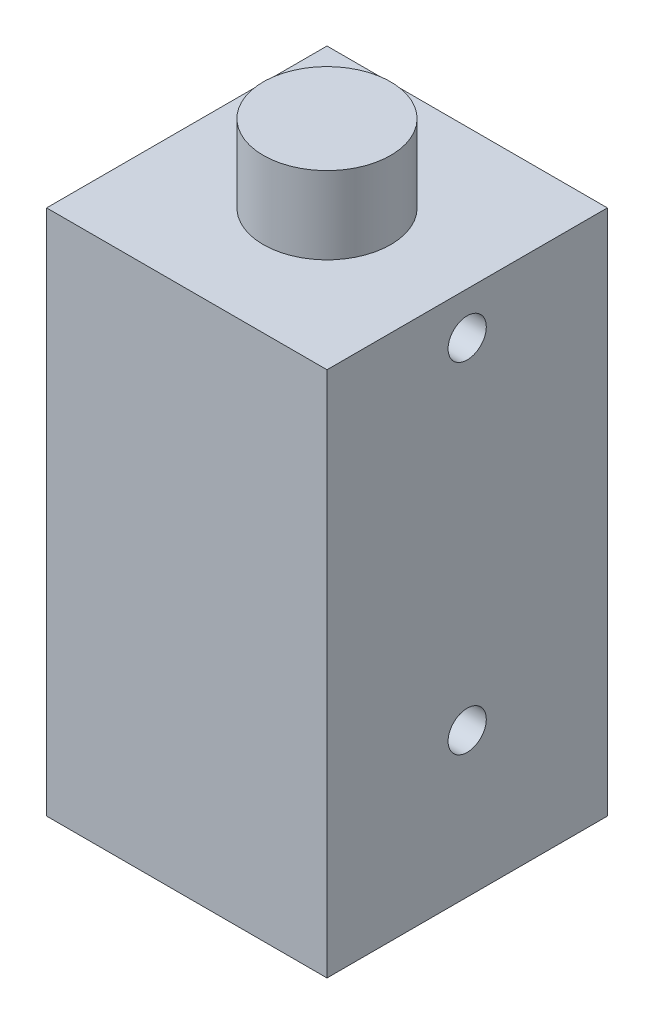
ISO-10303-21;
HEADER;
FILE_DESCRIPTION(('STEP AP214'),'2;1');
FILE_NAME('part.step','',(''),(''),'','','');
FILE_SCHEMA(('AUTOMOTIVE_DESIGN { 1 0 10303 214 1 1 1 1 }'));
ENDSEC;
DATA;
#1=APPLICATION_CONTEXT('core data for automotive mechanical design processes');
#2=APPLICATION_PROTOCOL_DEFINITION('international standard','automotive_design',2000,#1);
#3=PRODUCT_CONTEXT('',#1,'mechanical');
#4=PRODUCT('Part','Part','',(#3));
#5=PRODUCT_RELATED_PRODUCT_CATEGORY('part','',(#4));
#6=PRODUCT_DEFINITION_FORMATION('','',#4);
#7=PRODUCT_DEFINITION_CONTEXT('part definition',#1,'design');
#8=PRODUCT_DEFINITION('design','',#6,#7);
#9=PRODUCT_DEFINITION_SHAPE('','',#8);
#10=(LENGTH_UNIT() NAMED_UNIT(*) SI_UNIT(.MILLI.,.METRE.));
#11=(NAMED_UNIT(*) PLANE_ANGLE_UNIT() SI_UNIT($,.RADIAN.));
#12=(NAMED_UNIT(*) SI_UNIT($,.STERADIAN.) SOLID_ANGLE_UNIT());
#13=UNCERTAINTY_MEASURE_WITH_UNIT(LENGTH_MEASURE(1.E-05),#10,'distance_accuracy_value','');
#14=(GEOMETRIC_REPRESENTATION_CONTEXT(3) GLOBAL_UNCERTAINTY_ASSIGNED_CONTEXT((#13)) GLOBAL_UNIT_ASSIGNED_CONTEXT((#10,
#11,#12)) REPRESENTATION_CONTEXT('',''));
#15=CARTESIAN_POINT('',(0.,0.,0.));
#16=DIRECTION('',(0.,0.,1.));
#17=DIRECTION('',(1.,0.,0.));
#18=AXIS2_PLACEMENT_3D('',#15,#16,#17);
#19=CARTESIAN_POINT('',(16.5,62.,16.5));
#20=DIRECTION('',(-1.,0.,0.));
#21=DIRECTION('',(0.,0.,1.));
#22=AXIS2_PLACEMENT_3D('',#19,#20,#21);
#23=PLANE('',#22);
#24=CARTESIAN_POINT('',(16.5,57.,0.));
#25=DIRECTION('',(1.,0.,0.));
#26=DIRECTION('',(0.,0.,-1.));
#27=AXIS2_PLACEMENT_3D('',#24,#25,#26);
#28=CIRCLE('',#27,2.25);
#29=CARTESIAN_POINT('',(16.5,57.,-2.25));
#30=VERTEX_POINT('',#29);
#31=EDGE_CURVE('E122',#30,#30,#28,.T.);
#32=ORIENTED_EDGE('',*,*,#31,.F.);
#33=EDGE_LOOP('',(#32));
#34=FACE_BOUND('',#33,.T.);
#35=CARTESIAN_POINT('',(16.5,17.,0.));
#36=DIRECTION('',(1.,0.,0.));
#37=DIRECTION('',(0.,0.,-1.));
#38=AXIS2_PLACEMENT_3D('',#35,#36,#37);
#39=CIRCLE('',#38,2.25);
#40=CARTESIAN_POINT('',(16.5,17.,-2.25000000000001));
#41=VERTEX_POINT('',#40);
#42=EDGE_CURVE('E116',#41,#41,#39,.T.);
#43=ORIENTED_EDGE('',*,*,#42,.F.);
#44=EDGE_LOOP('',(#43));
#45=FACE_BOUND('',#44,.T.);
#46=DIRECTION('',(0.,0.,-1.));
#47=VECTOR('',#46,1.);
#48=CARTESIAN_POINT('',(16.5,0.,16.5));
#49=LINE('',#48,#47);
#50=CARTESIAN_POINT('',(16.5,0.,16.5));
#51=VERTEX_POINT('',#50);
#52=CARTESIAN_POINT('',(16.5,0.,-16.5));
#53=VERTEX_POINT('',#52);
#54=EDGE_CURVE('E99',#51,#53,#49,.T.);
#55=ORIENTED_EDGE('',*,*,#54,.T.);
#56=DIRECTION('',(0.,-1.,0.));
#57=VECTOR('',#56,1.);
#58=CARTESIAN_POINT('',(16.5,62.,-16.5));
#59=LINE('',#58,#57);
#60=CARTESIAN_POINT('',(16.5,62.,-16.5));
#61=VERTEX_POINT('',#60);
#62=EDGE_CURVE('E36',#61,#53,#59,.T.);
#63=ORIENTED_EDGE('',*,*,#62,.F.);
#64=DIRECTION('',(0.,0.,-1.));
#65=VECTOR('',#64,1.);
#66=CARTESIAN_POINT('',(16.5,62.,16.5));
#67=LINE('',#66,#65);
#68=CARTESIAN_POINT('',(16.5,62.,16.5));
#69=VERTEX_POINT('',#68);
#70=EDGE_CURVE('E86',#69,#61,#67,.T.);
#71=ORIENTED_EDGE('',*,*,#70,.F.);
#72=DIRECTION('',(0.,-1.,0.));
#73=VECTOR('',#72,1.);
#74=CARTESIAN_POINT('',(16.5,62.,16.5));
#75=LINE('',#74,#73);
#76=EDGE_CURVE('E95',#69,#51,#75,.T.);
#77=ORIENTED_EDGE('',*,*,#76,.T.);
#78=EDGE_LOOP('',(#55,#63,#71,#77));
#79=FACE_BOUND('',#78,.T.);
#80=ADVANCED_FACE('F33',(#34,#45,#79),#23,.F.);
#81=CARTESIAN_POINT('',(-16.5,62.,-16.5));
#82=DIRECTION('',(0.,0.,1.));
#83=DIRECTION('',(1.,0.,0.));
#84=AXIS2_PLACEMENT_3D('',#81,#82,#83);
#85=PLANE('',#84);
#86=DIRECTION('',(-1.,0.,0.));
#87=VECTOR('',#86,1.);
#88=CARTESIAN_POINT('',(-16.5,0.,-16.5));
#89=LINE('',#88,#87);
#90=CARTESIAN_POINT('',(-16.5,0.,-16.5));
#91=VERTEX_POINT('',#90);
#92=EDGE_CURVE('E91',#53,#91,#89,.T.);
#93=ORIENTED_EDGE('',*,*,#92,.T.);
#94=DIRECTION('',(0.,-1.,0.));
#95=VECTOR('',#94,1.);
#96=CARTESIAN_POINT('',(-16.5,62.,-16.5));
#97=LINE('',#96,#95);
#98=CARTESIAN_POINT('',(-16.5,62.,-16.5));
#99=VERTEX_POINT('',#98);
#100=EDGE_CURVE('E89',#99,#91,#97,.T.);
#101=ORIENTED_EDGE('',*,*,#100,.F.);
#102=DIRECTION('',(-1.,0.,0.));
#103=VECTOR('',#102,1.);
#104=CARTESIAN_POINT('',(-16.5,62.,-16.5));
#105=LINE('',#104,#103);
#106=EDGE_CURVE('E81',#61,#99,#105,.T.);
#107=ORIENTED_EDGE('',*,*,#106,.F.);
#108=ORIENTED_EDGE('',*,*,#62,.T.);
#109=EDGE_LOOP('',(#93,#101,#107,#108));
#110=FACE_BOUND('',#109,.T.);
#111=ADVANCED_FACE('F90',(#110),#85,.F.);
#112=CARTESIAN_POINT('',(-16.5,62.,16.5));
#113=DIRECTION('',(1.,0.,0.));
#114=DIRECTION('',(0.,0.,-1.));
#115=AXIS2_PLACEMENT_3D('',#112,#113,#114);
#116=PLANE('',#115);
#117=DIRECTION('',(0.,0.,1.));
#118=VECTOR('',#117,1.);
#119=CARTESIAN_POINT('',(-16.5,0.,16.5));
#120=LINE('',#119,#118);
#121=CARTESIAN_POINT('',(-16.5,0.,16.5));
#122=VERTEX_POINT('',#121);
#123=EDGE_CURVE('E67',#91,#122,#120,.T.);
#124=ORIENTED_EDGE('',*,*,#123,.T.);
#125=DIRECTION('',(0.,-1.,0.));
#126=VECTOR('',#125,1.);
#127=CARTESIAN_POINT('',(-16.5,62.,16.5));
#128=LINE('',#127,#126);
#129=CARTESIAN_POINT('',(-16.5,62.,16.5));
#130=VERTEX_POINT('',#129);
#131=EDGE_CURVE('E92',#130,#122,#128,.T.);
#132=ORIENTED_EDGE('',*,*,#131,.F.);
#133=DIRECTION('',(0.,0.,1.));
#134=VECTOR('',#133,1.);
#135=CARTESIAN_POINT('',(-16.5,62.,16.5));
#136=LINE('',#135,#134);
#137=EDGE_CURVE('E84',#99,#130,#136,.T.);
#138=ORIENTED_EDGE('',*,*,#137,.F.);
#139=ORIENTED_EDGE('',*,*,#100,.T.);
#140=EDGE_LOOP('',(#124,#132,#138,#139));
#141=FACE_BOUND('',#140,.T.);
#142=ADVANCED_FACE('F93',(#141),#116,.F.);
#143=CARTESIAN_POINT('',(-16.5,62.,16.5));
#144=DIRECTION('',(0.,0.,-1.));
#145=DIRECTION('',(-1.,0.,0.));
#146=AXIS2_PLACEMENT_3D('',#143,#144,#145);
#147=PLANE('',#146);
#148=DIRECTION('',(1.,0.,0.));
#149=VECTOR('',#148,1.);
#150=CARTESIAN_POINT('',(-16.5,0.,16.5));
#151=LINE('',#150,#149);
#152=EDGE_CURVE('E73',#122,#51,#151,.T.);
#153=ORIENTED_EDGE('',*,*,#152,.T.);
#154=ORIENTED_EDGE('',*,*,#76,.F.);
#155=DIRECTION('',(1.,0.,0.));
#156=VECTOR('',#155,1.);
#157=CARTESIAN_POINT('',(-16.5,62.,16.5));
#158=LINE('',#157,#156);
#159=EDGE_CURVE('E50',#130,#69,#158,.T.);
#160=ORIENTED_EDGE('',*,*,#159,.F.);
#161=ORIENTED_EDGE('',*,*,#131,.T.);
#162=EDGE_LOOP('',(#153,#154,#160,#161));
#163=FACE_BOUND('',#162,.T.);
#164=ADVANCED_FACE('F107',(#163),#147,.F.);
#165=CARTESIAN_POINT('',(0.,62.,0.));
#166=DIRECTION('',(0.,-1.,0.));
#167=DIRECTION('',(0.,0.,-1.));
#168=AXIS2_PLACEMENT_3D('',#165,#166,#167);
#169=PLANE('',#168);
#170=CARTESIAN_POINT('',(0.,62.,0.));
#171=DIRECTION('',(0.,1.,0.));
#172=DIRECTION('',(0.,0.,1.));
#173=AXIS2_PLACEMENT_3D('',#170,#171,#172);
#174=CIRCLE('',#173,7.5);
#175=CARTESIAN_POINT('',(0.,62.,7.5));
#176=VERTEX_POINT('',#175);
#177=EDGE_CURVE('E11',#176,#176,#174,.T.);
#178=ORIENTED_EDGE('',*,*,#177,.F.);
#179=EDGE_LOOP('',(#178));
#180=FACE_BOUND('',#179,.T.);
#181=ORIENTED_EDGE('',*,*,#70,.T.);
#182=ORIENTED_EDGE('',*,*,#106,.T.);
#183=ORIENTED_EDGE('',*,*,#137,.T.);
#184=ORIENTED_EDGE('',*,*,#159,.T.);
#185=EDGE_LOOP('',(#181,#182,#183,#184));
#186=FACE_BOUND('',#185,.T.);
#187=ADVANCED_FACE('F82',(#180,#186),#169,.F.);
#188=CARTESIAN_POINT('',(0.,0.,0.));
#189=DIRECTION('',(0.,-1.,0.));
#190=DIRECTION('',(0.,0.,-1.));
#191=AXIS2_PLACEMENT_3D('',#188,#189,#190);
#192=PLANE('',#191);
#193=ORIENTED_EDGE('',*,*,#54,.F.);
#194=ORIENTED_EDGE('',*,*,#152,.F.);
#195=ORIENTED_EDGE('',*,*,#123,.F.);
#196=ORIENTED_EDGE('',*,*,#92,.F.);
#197=EDGE_LOOP('',(#193,#194,#195,#196));
#198=FACE_BOUND('',#197,.T.);
#199=ADVANCED_FACE('F110',(#198),#192,.T.);
#200=CARTESIAN_POINT('',(0.,71.1,0.));
#201=DIRECTION('',(0.,-1.,0.));
#202=DIRECTION('',(0.,0.,-1.));
#203=AXIS2_PLACEMENT_3D('',#200,#201,#202);
#204=CYLINDRICAL_SURFACE('',#203,7.5);
#205=CARTESIAN_POINT('',(0.,71.1,0.));
#206=DIRECTION('',(0.,1.,0.));
#207=DIRECTION('',(0.,0.,1.));
#208=AXIS2_PLACEMENT_3D('',#205,#206,#207);
#209=CIRCLE('',#208,7.5);
#210=CARTESIAN_POINT('',(0.,71.1,7.5));
#211=VERTEX_POINT('',#210);
#212=EDGE_CURVE('E102',#211,#211,#209,.T.);
#213=ORIENTED_EDGE('',*,*,#212,.F.);
#214=EDGE_LOOP('',(#213));
#215=FACE_BOUND('',#214,.T.);
#216=ORIENTED_EDGE('',*,*,#177,.T.);
#217=EDGE_LOOP('',(#216));
#218=FACE_BOUND('',#217,.T.);
#219=ADVANCED_FACE('F152',(#215,#218),#204,.T.);
#220=CARTESIAN_POINT('',(0.,71.1,0.));
#221=DIRECTION('',(0.,1.,0.));
#222=DIRECTION('',(0.,0.,1.));
#223=AXIS2_PLACEMENT_3D('',#220,#221,#222);
#224=PLANE('',#223);
#225=ORIENTED_EDGE('',*,*,#212,.T.);
#226=EDGE_LOOP('',(#225));
#227=FACE_BOUND('',#226,.T.);
#228=ADVANCED_FACE('F143',(#227),#224,.T.);
#229=CARTESIAN_POINT('',(7.4,17.,0.));
#230=DIRECTION('',(1.,0.,0.));
#231=DIRECTION('',(0.,0.,-1.));
#232=AXIS2_PLACEMENT_3D('',#229,#230,#231);
#233=CYLINDRICAL_SURFACE('',#232,2.25);
#234=CARTESIAN_POINT('',(7.4,17.,0.));
#235=DIRECTION('',(1.,0.,0.));
#236=DIRECTION('',(0.,0.,-1.));
#237=AXIS2_PLACEMENT_3D('',#234,#235,#236);
#238=CIRCLE('',#237,2.25);
#239=CARTESIAN_POINT('',(7.4,17.,-2.25000000000001));
#240=VERTEX_POINT('',#239);
#241=EDGE_CURVE('E119',#240,#240,#238,.T.);
#242=ORIENTED_EDGE('',*,*,#241,.F.);
#243=EDGE_LOOP('',(#242));
#244=FACE_BOUND('',#243,.T.);
#245=ORIENTED_EDGE('',*,*,#42,.T.);
#246=EDGE_LOOP('',(#245));
#247=FACE_BOUND('',#246,.T.);
#248=ADVANCED_FACE('F141',(#244,#247),#233,.F.);
#249=CARTESIAN_POINT('',(7.4,17.,0.));
#250=DIRECTION('',(1.,0.,0.));
#251=DIRECTION('',(0.,0.,-1.));
#252=AXIS2_PLACEMENT_3D('',#249,#250,#251);
#253=PLANE('',#252);
#254=ORIENTED_EDGE('',*,*,#241,.T.);
#255=EDGE_LOOP('',(#254));
#256=FACE_BOUND('',#255,.T.);
#257=ADVANCED_FACE('F133',(#256),#253,.T.);
#258=CARTESIAN_POINT('',(7.4,57.,0.));
#259=DIRECTION('',(1.,0.,0.));
#260=DIRECTION('',(0.,0.,-1.));
#261=AXIS2_PLACEMENT_3D('',#258,#259,#260);
#262=CYLINDRICAL_SURFACE('',#261,2.25);
#263=CARTESIAN_POINT('',(7.4,57.,0.));
#264=DIRECTION('',(1.,0.,0.));
#265=DIRECTION('',(0.,0.,-1.));
#266=AXIS2_PLACEMENT_3D('',#263,#264,#265);
#267=CIRCLE('',#266,2.25);
#268=CARTESIAN_POINT('',(7.4,57.,-2.25));
#269=VERTEX_POINT('',#268);
#270=EDGE_CURVE('E115',#269,#269,#267,.T.);
#271=ORIENTED_EDGE('',*,*,#270,.F.);
#272=EDGE_LOOP('',(#271));
#273=FACE_BOUND('',#272,.T.);
#274=ORIENTED_EDGE('',*,*,#31,.T.);
#275=EDGE_LOOP('',(#274));
#276=FACE_BOUND('',#275,.T.);
#277=ADVANCED_FACE('F130',(#273,#276),#262,.F.);
#278=CARTESIAN_POINT('',(7.4,57.,0.));
#279=DIRECTION('',(1.,0.,0.));
#280=DIRECTION('',(0.,0.,-1.));
#281=AXIS2_PLACEMENT_3D('',#278,#279,#280);
#282=PLANE('',#281);
#283=ORIENTED_EDGE('',*,*,#270,.T.);
#284=EDGE_LOOP('',(#283));
#285=FACE_BOUND('',#284,.T.);
#286=ADVANCED_FACE('F128',(#285),#282,.T.);
#287=CLOSED_SHELL('',(#80,#111,#142,#164,#187,#199,#219,#228,#248,#257,#277,#286));
#288=MANIFOLD_SOLID_BREP('B2',#287);
#289=ADVANCED_BREP_SHAPE_REPRESENTATION('',(#18,#288),#14);
#290=SHAPE_DEFINITION_REPRESENTATION(#9,#289);
ENDSEC;
END-ISO-10303-21;
